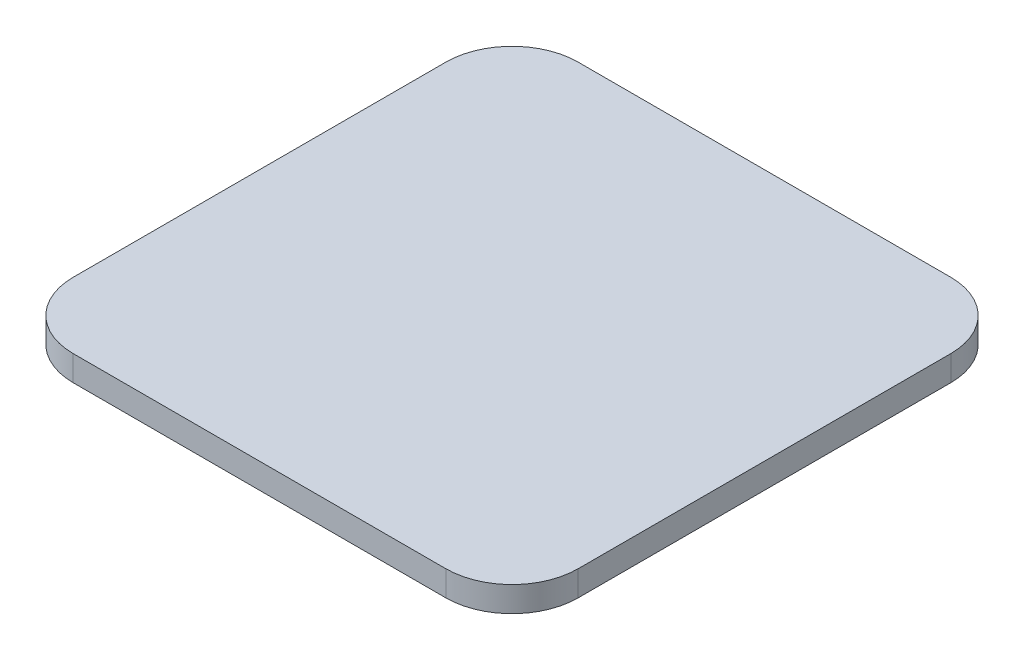
ISO-10303-21;
HEADER;
FILE_DESCRIPTION(('STEP AP214'),'2;1');
FILE_NAME('part.step','',(''),(''),'','','');
FILE_SCHEMA(('AUTOMOTIVE_DESIGN { 1 0 10303 214 1 1 1 1 }'));
ENDSEC;
DATA;
#1=APPLICATION_CONTEXT('core data for automotive mechanical design processes');
#2=APPLICATION_PROTOCOL_DEFINITION('international standard','automotive_design',2000,#1);
#3=PRODUCT_CONTEXT('',#1,'mechanical');
#4=PRODUCT('Part','Part','',(#3));
#5=PRODUCT_RELATED_PRODUCT_CATEGORY('part','',(#4));
#6=PRODUCT_DEFINITION_FORMATION('','',#4);
#7=PRODUCT_DEFINITION_CONTEXT('part definition',#1,'design');
#8=PRODUCT_DEFINITION('design','',#6,#7);
#9=PRODUCT_DEFINITION_SHAPE('','',#8);
#10=(LENGTH_UNIT() NAMED_UNIT(*) SI_UNIT(.MILLI.,.METRE.));
#11=(NAMED_UNIT(*) PLANE_ANGLE_UNIT() SI_UNIT($,.RADIAN.));
#12=(NAMED_UNIT(*) SI_UNIT($,.STERADIAN.) SOLID_ANGLE_UNIT());
#13=UNCERTAINTY_MEASURE_WITH_UNIT(LENGTH_MEASURE(1.E-05),#10,'distance_accuracy_value','');
#14=(GEOMETRIC_REPRESENTATION_CONTEXT(3) GLOBAL_UNCERTAINTY_ASSIGNED_CONTEXT((#13)) GLOBAL_UNIT_ASSIGNED_CONTEXT((#10,
#11,#12)) REPRESENTATION_CONTEXT('',''));
#15=CARTESIAN_POINT('',(0.,0.,0.));
#16=DIRECTION('',(0.,0.,1.));
#17=DIRECTION('',(1.,0.,0.));
#18=AXIS2_PLACEMENT_3D('',#15,#16,#17);
#19=CARTESIAN_POINT('',(37.4951198592007,5.08,37.4951198592006));
#20=DIRECTION('',(0.,-1.,0.));
#21=DIRECTION('',(0.,0.,-1.));
#22=AXIS2_PLACEMENT_3D('',#19,#20,#21);
#23=CYLINDRICAL_SURFACE('',#22,13.3048801407993);
#24=CARTESIAN_POINT('',(37.4951198592007,0.,37.4951198592006));
#25=DIRECTION('',(0.,1.,0.));
#26=DIRECTION('',(0.,0.,1.));
#27=AXIS2_PLACEMENT_3D('',#24,#25,#26);
#28=CIRCLE('',#27,13.3048801407993);
#29=CARTESIAN_POINT('',(37.4951198592006,0.,50.8));
#30=VERTEX_POINT('',#29);
#31=CARTESIAN_POINT('',(50.8,0.,37.4951198592005));
#32=VERTEX_POINT('',#31);
#33=EDGE_CURVE('E142',#30,#32,#28,.T.);
#34=ORIENTED_EDGE('',*,*,#33,.T.);
#35=DIRECTION('',(0.,-1.,0.));
#36=VECTOR('',#35,1.);
#37=CARTESIAN_POINT('',(50.8,5.08,37.4951198592005));
#38=LINE('',#37,#36);
#39=CARTESIAN_POINT('',(50.8,5.08,37.4951198592005));
#40=VERTEX_POINT('',#39);
#41=EDGE_CURVE('E170',#40,#32,#38,.T.);
#42=ORIENTED_EDGE('',*,*,#41,.F.);
#43=CARTESIAN_POINT('',(37.4951198592007,5.08,37.4951198592006));
#44=DIRECTION('',(0.,1.,0.));
#45=DIRECTION('',(0.,0.,1.));
#46=AXIS2_PLACEMENT_3D('',#43,#44,#45);
#47=CIRCLE('',#46,13.3048801407993);
#48=CARTESIAN_POINT('',(37.4951198592006,5.08,50.8));
#49=VERTEX_POINT('',#48);
#50=EDGE_CURVE('E157',#49,#40,#47,.T.);
#51=ORIENTED_EDGE('',*,*,#50,.F.);
#52=DIRECTION('',(0.,-1.,0.));
#53=VECTOR('',#52,1.);
#54=CARTESIAN_POINT('',(37.4951198592006,5.08,50.8));
#55=LINE('',#54,#53);
#56=EDGE_CURVE('E138',#49,#30,#55,.T.);
#57=ORIENTED_EDGE('',*,*,#56,.T.);
#58=EDGE_LOOP('',(#34,#42,#51,#57));
#59=FACE_BOUND('',#58,.T.);
#60=ADVANCED_FACE('F43',(#59),#23,.T.);
#61=CARTESIAN_POINT('',(50.8,5.08,-37.4951198592006));
#62=DIRECTION('',(-1.,0.,0.));
#63=DIRECTION('',(0.,0.,1.));
#64=AXIS2_PLACEMENT_3D('',#61,#62,#63);
#65=PLANE('',#64);
#66=DIRECTION('',(0.,0.,-1.));
#67=VECTOR('',#66,1.);
#68=CARTESIAN_POINT('',(50.8,0.,-37.4951198592006));
#69=LINE('',#68,#67);
#70=CARTESIAN_POINT('',(50.8,0.,-37.4951198592006));
#71=VERTEX_POINT('',#70);
#72=EDGE_CURVE('E145',#32,#71,#69,.T.);
#73=ORIENTED_EDGE('',*,*,#72,.T.);
#74=DIRECTION('',(0.,-1.,0.));
#75=VECTOR('',#74,1.);
#76=CARTESIAN_POINT('',(50.8,5.08,-37.4951198592006));
#77=LINE('',#76,#75);
#78=CARTESIAN_POINT('',(50.8,5.08,-37.4951198592006));
#79=VERTEX_POINT('',#78);
#80=EDGE_CURVE('E167',#79,#71,#77,.T.);
#81=ORIENTED_EDGE('',*,*,#80,.F.);
#82=DIRECTION('',(0.,0.,-1.));
#83=VECTOR('',#82,1.);
#84=CARTESIAN_POINT('',(50.8,5.08,-37.4951198592006));
#85=LINE('',#84,#83);
#86=EDGE_CURVE('E105',#40,#79,#85,.T.);
#87=ORIENTED_EDGE('',*,*,#86,.F.);
#88=ORIENTED_EDGE('',*,*,#41,.T.);
#89=EDGE_LOOP('',(#73,#81,#87,#88));
#90=FACE_BOUND('',#89,.T.);
#91=ADVANCED_FACE('F215',(#90),#65,.F.);
#92=CARTESIAN_POINT('',(37.4951198592006,5.08,-37.4951198592007));
#93=DIRECTION('',(0.,-1.,0.));
#94=DIRECTION('',(0.,0.,-1.));
#95=AXIS2_PLACEMENT_3D('',#92,#93,#94);
#96=CYLINDRICAL_SURFACE('',#95,13.3048801407993);
#97=CARTESIAN_POINT('',(37.4951198592006,0.,-37.4951198592007));
#98=DIRECTION('',(0.,1.,0.));
#99=DIRECTION('',(0.,0.,-1.));
#100=AXIS2_PLACEMENT_3D('',#97,#98,#99);
#101=CIRCLE('',#100,13.3048801407993);
#102=CARTESIAN_POINT('',(37.4951198592006,0.,-50.8));
#103=VERTEX_POINT('',#102);
#104=EDGE_CURVE('E148',#71,#103,#101,.T.);
#105=ORIENTED_EDGE('',*,*,#104,.T.);
#106=DIRECTION('',(0.,-1.,0.));
#107=VECTOR('',#106,1.);
#108=CARTESIAN_POINT('',(37.4951198592006,5.08,-50.8));
#109=LINE('',#108,#107);
#110=CARTESIAN_POINT('',(37.4951198592006,5.08,-50.8));
#111=VERTEX_POINT('',#110);
#112=EDGE_CURVE('E164',#111,#103,#109,.T.);
#113=ORIENTED_EDGE('',*,*,#112,.F.);
#114=CARTESIAN_POINT('',(37.4951198592006,5.08,-37.4951198592007));
#115=DIRECTION('',(0.,1.,0.));
#116=DIRECTION('',(0.,0.,-1.));
#117=AXIS2_PLACEMENT_3D('',#114,#115,#116);
#118=CIRCLE('',#117,13.3048801407993);
#119=EDGE_CURVE('E184',#79,#111,#118,.T.);
#120=ORIENTED_EDGE('',*,*,#119,.F.);
#121=ORIENTED_EDGE('',*,*,#80,.T.);
#122=EDGE_LOOP('',(#105,#113,#120,#121));
#123=FACE_BOUND('',#122,.T.);
#124=ADVANCED_FACE('F219',(#123),#96,.T.);
#125=CARTESIAN_POINT('',(-37.4951198592006,5.08,-50.8));
#126=DIRECTION('',(0.,0.,1.));
#127=DIRECTION('',(1.,0.,0.));
#128=AXIS2_PLACEMENT_3D('',#125,#126,#127);
#129=PLANE('',#128);
#130=DIRECTION('',(-1.,0.,0.));
#131=VECTOR('',#130,1.);
#132=CARTESIAN_POINT('',(-37.4951198592006,0.,-50.8));
#133=LINE('',#132,#131);
#134=CARTESIAN_POINT('',(-37.4951198592006,0.,-50.8));
#135=VERTEX_POINT('',#134);
#136=EDGE_CURVE('E150',#103,#135,#133,.T.);
#137=ORIENTED_EDGE('',*,*,#136,.T.);
#138=DIRECTION('',(0.,-1.,0.));
#139=VECTOR('',#138,1.);
#140=CARTESIAN_POINT('',(-37.4951198592006,5.08,-50.8));
#141=LINE('',#140,#139);
#142=CARTESIAN_POINT('',(-37.4951198592006,5.08,-50.8));
#143=VERTEX_POINT('',#142);
#144=EDGE_CURVE('E161',#143,#135,#141,.T.);
#145=ORIENTED_EDGE('',*,*,#144,.F.);
#146=DIRECTION('',(-1.,0.,0.));
#147=VECTOR('',#146,1.);
#148=CARTESIAN_POINT('',(-37.4951198592006,5.08,-50.8));
#149=LINE('',#148,#147);
#150=EDGE_CURVE('E186',#111,#143,#149,.T.);
#151=ORIENTED_EDGE('',*,*,#150,.F.);
#152=ORIENTED_EDGE('',*,*,#112,.T.);
#153=EDGE_LOOP('',(#137,#145,#151,#152));
#154=FACE_BOUND('',#153,.T.);
#155=ADVANCED_FACE('F192',(#154),#129,.F.);
#156=CARTESIAN_POINT('',(-37.4951198592007,5.08,-37.4951198592007));
#157=DIRECTION('',(0.,-1.,0.));
#158=DIRECTION('',(0.,0.,-1.));
#159=AXIS2_PLACEMENT_3D('',#156,#157,#158);
#160=CYLINDRICAL_SURFACE('',#159,13.3048801407993);
#161=CARTESIAN_POINT('',(-37.4951198592007,0.,-37.4951198592007));
#162=DIRECTION('',(0.,1.,0.));
#163=DIRECTION('',(0.,0.,1.));
#164=AXIS2_PLACEMENT_3D('',#161,#162,#163);
#165=CIRCLE('',#164,13.3048801407993);
#166=CARTESIAN_POINT('',(-50.8,0.,-37.4951198592006));
#167=VERTEX_POINT('',#166);
#168=EDGE_CURVE('E152',#135,#167,#165,.T.);
#169=ORIENTED_EDGE('',*,*,#168,.T.);
#170=DIRECTION('',(0.,-1.,0.));
#171=VECTOR('',#170,1.);
#172=CARTESIAN_POINT('',(-50.8,5.08,-37.4951198592006));
#173=LINE('',#172,#171);
#174=CARTESIAN_POINT('',(-50.8,5.08,-37.4951198592006));
#175=VERTEX_POINT('',#174);
#176=EDGE_CURVE('E133',#175,#167,#173,.T.);
#177=ORIENTED_EDGE('',*,*,#176,.F.);
#178=CARTESIAN_POINT('',(-37.4951198592007,5.08,-37.4951198592007));
#179=DIRECTION('',(0.,1.,0.));
#180=DIRECTION('',(0.,0.,1.));
#181=AXIS2_PLACEMENT_3D('',#178,#179,#180);
#182=CIRCLE('',#181,13.3048801407993);
#183=EDGE_CURVE('E124',#143,#175,#182,.T.);
#184=ORIENTED_EDGE('',*,*,#183,.F.);
#185=ORIENTED_EDGE('',*,*,#144,.T.);
#186=EDGE_LOOP('',(#169,#177,#184,#185));
#187=FACE_BOUND('',#186,.T.);
#188=ADVANCED_FACE('F196',(#187),#160,.T.);
#189=CARTESIAN_POINT('',(-50.8,5.08,-37.4951198592006));
#190=DIRECTION('',(1.,0.,0.));
#191=DIRECTION('',(0.,0.,-1.));
#192=AXIS2_PLACEMENT_3D('',#189,#190,#191);
#193=PLANE('',#192);
#194=DIRECTION('',(0.,0.,1.));
#195=VECTOR('',#194,1.);
#196=CARTESIAN_POINT('',(-50.8,0.,-37.4951198592006));
#197=LINE('',#196,#195);
#198=CARTESIAN_POINT('',(-50.8,0.,37.4951198592005));
#199=VERTEX_POINT('',#198);
#200=EDGE_CURVE('E132',#167,#199,#197,.T.);
#201=ORIENTED_EDGE('',*,*,#200,.T.);
#202=DIRECTION('',(0.,-1.,0.));
#203=VECTOR('',#202,1.);
#204=CARTESIAN_POINT('',(-50.8,5.08,37.4951198592005));
#205=LINE('',#204,#203);
#206=CARTESIAN_POINT('',(-50.8,5.08,37.4951198592005));
#207=VERTEX_POINT('',#206);
#208=EDGE_CURVE('E129',#207,#199,#205,.T.);
#209=ORIENTED_EDGE('',*,*,#208,.F.);
#210=DIRECTION('',(0.,0.,1.));
#211=VECTOR('',#210,1.);
#212=CARTESIAN_POINT('',(-50.8,5.08,-37.4951198592006));
#213=LINE('',#212,#211);
#214=EDGE_CURVE('E118',#175,#207,#213,.T.);
#215=ORIENTED_EDGE('',*,*,#214,.F.);
#216=ORIENTED_EDGE('',*,*,#176,.T.);
#217=EDGE_LOOP('',(#201,#209,#215,#216));
#218=FACE_BOUND('',#217,.T.);
#219=ADVANCED_FACE('F130',(#218),#193,.F.);
#220=CARTESIAN_POINT('',(-37.4951198592006,5.08,37.4951198592006));
#221=DIRECTION('',(0.,-1.,0.));
#222=DIRECTION('',(0.,0.,-1.));
#223=AXIS2_PLACEMENT_3D('',#220,#221,#222);
#224=CYLINDRICAL_SURFACE('',#223,13.3048801407993);
#225=CARTESIAN_POINT('',(-37.4951198592006,0.,37.4951198592006));
#226=DIRECTION('',(0.,1.,0.));
#227=DIRECTION('',(0.,0.,1.));
#228=AXIS2_PLACEMENT_3D('',#225,#226,#227);
#229=CIRCLE('',#228,13.3048801407993);
#230=CARTESIAN_POINT('',(-37.4951198592005,0.,50.8));
#231=VERTEX_POINT('',#230);
#232=EDGE_CURVE('E90',#199,#231,#229,.T.);
#233=ORIENTED_EDGE('',*,*,#232,.T.);
#234=DIRECTION('',(0.,-1.,0.));
#235=VECTOR('',#234,1.);
#236=CARTESIAN_POINT('',(-37.4951198592005,5.08,50.8));
#237=LINE('',#236,#235);
#238=CARTESIAN_POINT('',(-37.4951198592005,5.08,50.8));
#239=VERTEX_POINT('',#238);
#240=EDGE_CURVE('E134',#239,#231,#237,.T.);
#241=ORIENTED_EDGE('',*,*,#240,.F.);
#242=CARTESIAN_POINT('',(-37.4951198592006,5.08,37.4951198592006));
#243=DIRECTION('',(0.,1.,0.));
#244=DIRECTION('',(0.,0.,1.));
#245=AXIS2_PLACEMENT_3D('',#242,#243,#244);
#246=CIRCLE('',#245,13.3048801407993);
#247=EDGE_CURVE('E122',#207,#239,#246,.T.);
#248=ORIENTED_EDGE('',*,*,#247,.F.);
#249=ORIENTED_EDGE('',*,*,#208,.T.);
#250=EDGE_LOOP('',(#233,#241,#248,#249));
#251=FACE_BOUND('',#250,.T.);
#252=ADVANCED_FACE('F136',(#251),#224,.T.);
#253=CARTESIAN_POINT('',(-37.4951198592005,5.08,50.8));
#254=DIRECTION('',(0.,0.,-1.));
#255=DIRECTION('',(-1.,0.,0.));
#256=AXIS2_PLACEMENT_3D('',#253,#254,#255);
#257=PLANE('',#256);
#258=DIRECTION('',(1.,0.,0.));
#259=VECTOR('',#258,1.);
#260=CARTESIAN_POINT('',(-37.4951198592005,0.,50.8));
#261=LINE('',#260,#259);
#262=EDGE_CURVE('E96',#231,#30,#261,.T.);
#263=ORIENTED_EDGE('',*,*,#262,.T.);
#264=ORIENTED_EDGE('',*,*,#56,.F.);
#265=DIRECTION('',(1.,0.,0.));
#266=VECTOR('',#265,1.);
#267=CARTESIAN_POINT('',(-37.4951198592005,5.08,50.8));
#268=LINE('',#267,#266);
#269=EDGE_CURVE('E61',#239,#49,#268,.T.);
#270=ORIENTED_EDGE('',*,*,#269,.F.);
#271=ORIENTED_EDGE('',*,*,#240,.T.);
#272=EDGE_LOOP('',(#263,#264,#270,#271));
#273=FACE_BOUND('',#272,.T.);
#274=ADVANCED_FACE('F204',(#273),#257,.F.);
#275=CARTESIAN_POINT('',(37.4951198592007,5.08,37.4951198592006));
#276=DIRECTION('',(0.,1.,0.));
#277=DIRECTION('',(0.,0.,1.));
#278=AXIS2_PLACEMENT_3D('',#275,#276,#277);
#279=PLANE('',#278);
#280=ORIENTED_EDGE('',*,*,#50,.T.);
#281=ORIENTED_EDGE('',*,*,#86,.T.);
#282=ORIENTED_EDGE('',*,*,#119,.T.);
#283=ORIENTED_EDGE('',*,*,#150,.T.);
#284=ORIENTED_EDGE('',*,*,#183,.T.);
#285=ORIENTED_EDGE('',*,*,#214,.T.);
#286=ORIENTED_EDGE('',*,*,#247,.T.);
#287=ORIENTED_EDGE('',*,*,#269,.T.);
#288=EDGE_LOOP('',(#280,#281,#282,#283,#284,#285,#286,#287));
#289=FACE_BOUND('',#288,.T.);
#290=ADVANCED_FACE('F120',(#289),#279,.T.);
#291=CARTESIAN_POINT('',(37.4951198592007,0.,37.4951198592006));
#292=DIRECTION('',(0.,1.,0.));
#293=DIRECTION('',(0.,0.,1.));
#294=AXIS2_PLACEMENT_3D('',#291,#292,#293);
#295=PLANE('',#294);
#296=CARTESIAN_POINT('',(0.,0.,0.));
#297=DIRECTION('',(0.,-1.,0.));
#298=DIRECTION('',(0.,0.,-1.));
#299=AXIS2_PLACEMENT_3D('',#296,#297,#298);
#300=CIRCLE('',#299,38.1);
#301=CARTESIAN_POINT('',(0.,0.,-38.1));
#302=VERTEX_POINT('',#301);
#303=EDGE_CURVE('E171',#302,#302,#300,.T.);
#304=ORIENTED_EDGE('',*,*,#303,.F.);
#305=EDGE_LOOP('',(#304));
#306=FACE_BOUND('',#305,.T.);
#307=ORIENTED_EDGE('',*,*,#33,.F.);
#308=ORIENTED_EDGE('',*,*,#262,.F.);
#309=ORIENTED_EDGE('',*,*,#232,.F.);
#310=ORIENTED_EDGE('',*,*,#200,.F.);
#311=ORIENTED_EDGE('',*,*,#168,.F.);
#312=ORIENTED_EDGE('',*,*,#136,.F.);
#313=ORIENTED_EDGE('',*,*,#104,.F.);
#314=ORIENTED_EDGE('',*,*,#72,.F.);
#315=EDGE_LOOP('',(#307,#308,#309,#310,#311,#312,#313,#314));
#316=FACE_BOUND('',#315,.T.);
#317=ADVANCED_FACE('F199',(#306,#316),#295,.F.);
#318=CARTESIAN_POINT('',(0.,-10.16,0.));
#319=DIRECTION('',(0.,1.,0.));
#320=DIRECTION('',(0.,0.,1.));
#321=AXIS2_PLACEMENT_3D('',#318,#319,#320);
#322=CYLINDRICAL_SURFACE('',#321,38.1);
#323=CARTESIAN_POINT('',(0.,-5.08,0.));
#324=DIRECTION('',(0.,-1.,0.));
#325=DIRECTION('',(0.,0.,-1.));
#326=AXIS2_PLACEMENT_3D('',#323,#324,#325);
#327=CIRCLE('',#326,38.1);
#328=CARTESIAN_POINT('',(0.,-5.08,-38.1));
#329=VERTEX_POINT('',#328);
#330=EDGE_CURVE('E146',#329,#329,#327,.F.);
#331=ORIENTED_EDGE('',*,*,#330,.T.);
#332=EDGE_LOOP('',(#331));
#333=FACE_BOUND('',#332,.T.);
#334=ORIENTED_EDGE('',*,*,#303,.T.);
#335=EDGE_LOOP('',(#334));
#336=FACE_BOUND('',#335,.T.);
#337=ADVANCED_FACE('F257',(#333,#336),#322,.T.);
#338=CARTESIAN_POINT('',(0.,-7.62,0.));
#339=DIRECTION('',(0.,1.,0.));
#340=DIRECTION('',(0.,0.,1.));
#341=AXIS2_PLACEMENT_3D('',#338,#339,#340);
#342=TOROIDAL_SURFACE('',#341,38.1,2.54);
#343=CARTESIAN_POINT('',(0.,-10.16,0.));
#344=DIRECTION('',(0.,1.,0.));
#345=DIRECTION('',(0.,0.,1.));
#346=AXIS2_PLACEMENT_3D('',#343,#344,#345);
#347=CIRCLE('',#346,38.1);
#348=CARTESIAN_POINT('',(0.,-10.16,38.1));
#349=VERTEX_POINT('',#348);
#350=EDGE_CURVE('E328',#349,#349,#347,.T.);
#351=ORIENTED_EDGE('',*,*,#350,.T.);
#352=EDGE_LOOP('',(#351));
#353=FACE_BOUND('',#352,.T.);
#354=ORIENTED_EDGE('',*,*,#330,.F.);
#355=EDGE_LOOP('',(#354));
#356=FACE_BOUND('',#355,.T.);
#357=ADVANCED_FACE('F266',(#353,#356),#342,.T.);
#358=CARTESIAN_POINT('',(0.,-10.16,0.));
#359=DIRECTION('',(0.,-1.,0.));
#360=DIRECTION('',(0.,0.,-1.));
#361=AXIS2_PLACEMENT_3D('',#358,#359,#360);
#362=PLANE('',#361);
#363=CARTESIAN_POINT('',(0.,-10.16,0.));
#364=DIRECTION('',(0.,-1.,0.));
#365=DIRECTION('',(0.,0.,-1.));
#366=AXIS2_PLACEMENT_3D('',#363,#364,#365);
#367=CIRCLE('',#366,7.62);
#368=CARTESIAN_POINT('',(0.,-10.16,-7.62));
#369=VERTEX_POINT('',#368);
#370=EDGE_CURVE('E327',#369,#369,#367,.T.);
#371=ORIENTED_EDGE('',*,*,#370,.F.);
#372=EDGE_LOOP('',(#371));
#373=FACE_BOUND('',#372,.T.);
#374=ORIENTED_EDGE('',*,*,#350,.F.);
#375=EDGE_LOOP('',(#374));
#376=FACE_BOUND('',#375,.T.);
#377=ADVANCED_FACE('F277',(#373,#376),#362,.T.);
#378=CARTESIAN_POINT('',(0.,-38.1,0.));
#379=DIRECTION('',(0.,1.,0.));
#380=DIRECTION('',(0.,0.,1.));
#381=AXIS2_PLACEMENT_3D('',#378,#379,#380);
#382=CYLINDRICAL_SURFACE('',#381,7.62);
#383=CARTESIAN_POINT('',(0.,-37.1094,0.));
#384=DIRECTION('',(0.,-1.,0.));
#385=DIRECTION('',(0.,0.,-1.));
#386=AXIS2_PLACEMENT_3D('',#383,#384,#385);
#387=CIRCLE('',#386,7.62);
#388=CARTESIAN_POINT('',(0.,-37.1094,-7.62));
#389=VERTEX_POINT('',#388);
#390=EDGE_CURVE('E11',#389,#389,#387,.F.);
#391=ORIENTED_EDGE('',*,*,#390,.T.);
#392=EDGE_LOOP('',(#391));
#393=FACE_BOUND('',#392,.T.);
#394=ORIENTED_EDGE('',*,*,#370,.T.);
#395=EDGE_LOOP('',(#394));
#396=FACE_BOUND('',#395,.T.);
#397=ADVANCED_FACE('F287',(#393,#396),#382,.T.);
#398=CARTESIAN_POINT('',(0.,-38.1,0.));
#399=DIRECTION('',(0.,-1.,0.));
#400=DIRECTION('',(0.,0.,-1.));
#401=AXIS2_PLACEMENT_3D('',#398,#399,#400);
#402=PLANE('',#401);
#403=CARTESIAN_POINT('',(0.,-38.1,0.));
#404=DIRECTION('',(0.,-1.,0.));
#405=DIRECTION('',(0.,0.,-1.));
#406=AXIS2_PLACEMENT_3D('',#403,#404,#405);
#407=CIRCLE('',#406,6.62939999999999);
#408=CARTESIAN_POINT('',(0.,-38.1,-6.62939999999999));
#409=VERTEX_POINT('',#408);
#410=EDGE_CURVE('E53',#409,#409,#407,.T.);
#411=ORIENTED_EDGE('',*,*,#410,.T.);
#412=EDGE_LOOP('',(#411));
#413=FACE_BOUND('',#412,.T.);
#414=ADVANCED_FACE('F297',(#413),#402,.T.);
#415=CARTESIAN_POINT('',(0.,-38.1,0.));
#416=DIRECTION('',(0.,1.,0.));
#417=DIRECTION('',(0.,0.,1.));
#418=AXIS2_PLACEMENT_3D('',#415,#416,#417);
#419=CONICAL_SURFACE('',#418,6.62939999999999,0.78539816339744);
#420=ORIENTED_EDGE('',*,*,#390,.F.);
#421=EDGE_LOOP('',(#420));
#422=FACE_BOUND('',#421,.T.);
#423=ORIENTED_EDGE('',*,*,#410,.F.);
#424=EDGE_LOOP('',(#423));
#425=FACE_BOUND('',#424,.T.);
#426=ADVANCED_FACE('F46',(#422,#425),#419,.T.);
#427=CLOSED_SHELL('',(#60,#91,#124,#155,#188,#219,#252,#274,#290,#317,#337,#357,#377,#397,#414,#426));
#428=MANIFOLD_SOLID_BREP('B2',#427);
#429=ADVANCED_BREP_SHAPE_REPRESENTATION('',(#18,#428),#14);
#430=SHAPE_DEFINITION_REPRESENTATION(#9,#429);
ENDSEC;
END-ISO-10303-21;
